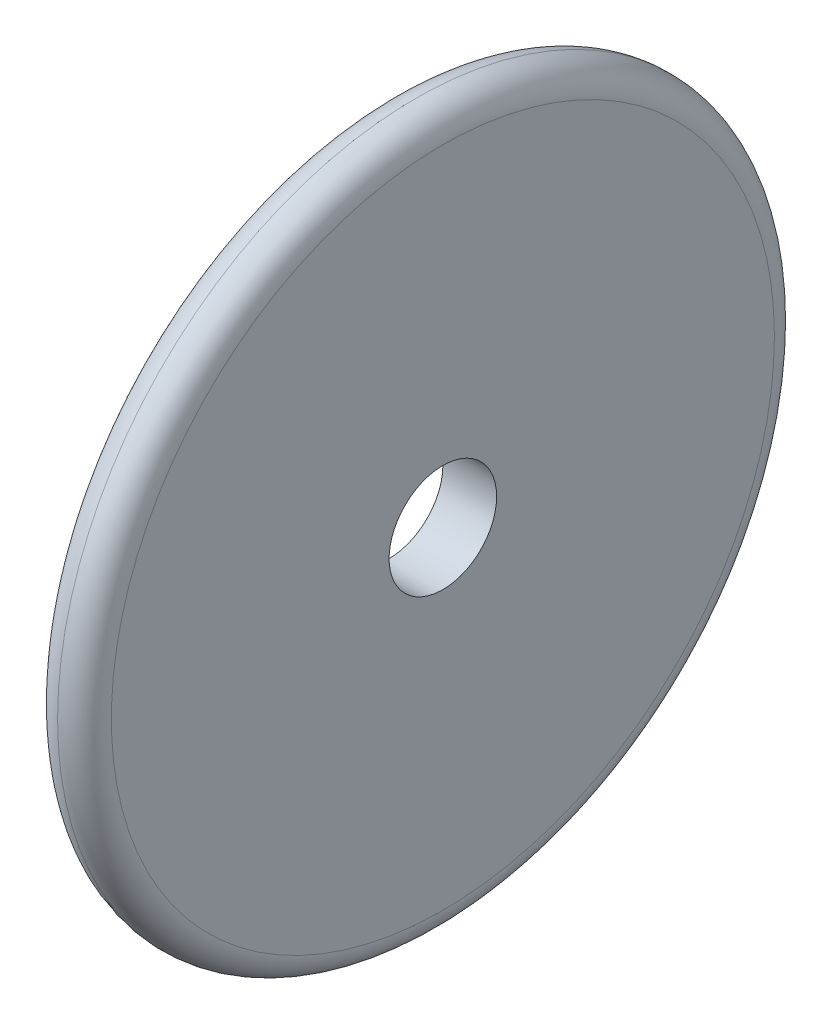
ISO-10303-21;
HEADER;
FILE_DESCRIPTION(('STEP AP214'),'2;1');
FILE_NAME('part.step','',(''),(''),'','','');
FILE_SCHEMA(('AUTOMOTIVE_DESIGN { 1 0 10303 214 1 1 1 1 }'));
ENDSEC;
DATA;
#1=APPLICATION_CONTEXT('core data for automotive mechanical design processes');
#2=APPLICATION_PROTOCOL_DEFINITION('international standard','automotive_design',2000,#1);
#3=PRODUCT_CONTEXT('',#1,'mechanical');
#4=PRODUCT('Part','Part','',(#3));
#5=PRODUCT_RELATED_PRODUCT_CATEGORY('part','',(#4));
#6=PRODUCT_DEFINITION_FORMATION('','',#4);
#7=PRODUCT_DEFINITION_CONTEXT('part definition',#1,'design');
#8=PRODUCT_DEFINITION('design','',#6,#7);
#9=PRODUCT_DEFINITION_SHAPE('','',#8);
#10=(LENGTH_UNIT() NAMED_UNIT(*) SI_UNIT(.MILLI.,.METRE.));
#11=(NAMED_UNIT(*) PLANE_ANGLE_UNIT() SI_UNIT($,.RADIAN.));
#12=(NAMED_UNIT(*) SI_UNIT($,.STERADIAN.) SOLID_ANGLE_UNIT());
#13=UNCERTAINTY_MEASURE_WITH_UNIT(LENGTH_MEASURE(1.E-05),#10,'distance_accuracy_value','');
#14=(GEOMETRIC_REPRESENTATION_CONTEXT(3) GLOBAL_UNCERTAINTY_ASSIGNED_CONTEXT((#13)) GLOBAL_UNIT_ASSIGNED_CONTEXT((#10,
#11,#12)) REPRESENTATION_CONTEXT('',''));
#15=CARTESIAN_POINT('',(0.,0.,0.));
#16=DIRECTION('',(0.,0.,1.));
#17=DIRECTION('',(1.,0.,0.));
#18=AXIS2_PLACEMENT_3D('',#15,#16,#17);
#19=CARTESIAN_POINT('',(1.5,0.,0.));
#20=DIRECTION('',(1.,0.,0.));
#21=DIRECTION('',(0.,0.,-1.));
#22=AXIS2_PLACEMENT_3D('',#19,#20,#21);
#23=PLANE('',#22);
#24=CARTESIAN_POINT('',(1.5,0.,0.));
#25=DIRECTION('',(1.,0.,0.));
#26=DIRECTION('',(0.,0.,-1.));
#27=AXIS2_PLACEMENT_3D('',#24,#25,#26);
#28=CIRCLE('',#27,9.25);
#29=CARTESIAN_POINT('',(1.5,0.,-9.25));
#30=VERTEX_POINT('',#29);
#31=EDGE_CURVE('E52',#30,#30,#28,.T.);
#32=ORIENTED_EDGE('',*,*,#31,.T.);
#33=EDGE_LOOP('',(#32));
#34=FACE_BOUND('',#33,.T.);
#35=CARTESIAN_POINT('',(1.5,0.,0.));
#36=DIRECTION('',(1.,0.,0.));
#37=DIRECTION('',(0.,0.,-1.));
#38=AXIS2_PLACEMENT_3D('',#35,#36,#37);
#39=CIRCLE('',#38,1.5);
#40=CARTESIAN_POINT('',(1.5,0.,-1.5));
#41=VERTEX_POINT('',#40);
#42=EDGE_CURVE('E57',#41,#41,#39,.T.);
#43=ORIENTED_EDGE('',*,*,#42,.F.);
#44=EDGE_LOOP('',(#43));
#45=FACE_BOUND('',#44,.T.);
#46=ADVANCED_FACE('F43',(#34,#45),#23,.T.);
#47=CARTESIAN_POINT('',(0.,0.,0.));
#48=DIRECTION('',(1.,0.,0.));
#49=DIRECTION('',(0.,0.,-1.));
#50=AXIS2_PLACEMENT_3D('',#47,#48,#49);
#51=PLANE('',#50);
#52=CARTESIAN_POINT('',(0.,0.,0.));
#53=DIRECTION('',(1.,0.,0.));
#54=DIRECTION('',(0.,0.,-1.));
#55=AXIS2_PLACEMENT_3D('',#52,#53,#54);
#56=CIRCLE('',#55,9.25);
#57=CARTESIAN_POINT('',(0.,0.,-9.25));
#58=VERTEX_POINT('',#57);
#59=EDGE_CURVE('E10',#58,#58,#56,.F.);
#60=ORIENTED_EDGE('',*,*,#59,.T.);
#61=EDGE_LOOP('',(#60));
#62=FACE_BOUND('',#61,.T.);
#63=CARTESIAN_POINT('',(0.,0.,0.));
#64=DIRECTION('',(1.,0.,0.));
#65=DIRECTION('',(0.,0.,-1.));
#66=AXIS2_PLACEMENT_3D('',#63,#64,#65);
#67=CIRCLE('',#66,1.5);
#68=CARTESIAN_POINT('',(0.,0.,-1.5));
#69=VERTEX_POINT('',#68);
#70=EDGE_CURVE('E60',#69,#69,#67,.T.);
#71=ORIENTED_EDGE('',*,*,#70,.T.);
#72=EDGE_LOOP('',(#71));
#73=FACE_BOUND('',#72,.T.);
#74=ADVANCED_FACE('F72',(#62,#73),#51,.F.);
#75=CARTESIAN_POINT('',(1.5,0.,0.));
#76=DIRECTION('',(-1.,0.,0.));
#77=DIRECTION('',(0.,0.,1.));
#78=AXIS2_PLACEMENT_3D('',#75,#76,#77);
#79=CYLINDRICAL_SURFACE('',#78,1.5);
#80=ORIENTED_EDGE('',*,*,#42,.T.);
#81=EDGE_LOOP('',(#80));
#82=FACE_BOUND('',#81,.T.);
#83=ORIENTED_EDGE('',*,*,#70,.F.);
#84=EDGE_LOOP('',(#83));
#85=FACE_BOUND('',#84,.T.);
#86=ADVANCED_FACE('F68',(#82,#85),#79,.F.);
#87=CARTESIAN_POINT('',(0.75,0.,0.));
#88=DIRECTION('',(1.,0.,0.));
#89=DIRECTION('',(0.,0.,-1.));
#90=AXIS2_PLACEMENT_3D('',#87,#88,#89);
#91=TOROIDAL_SURFACE('',#90,9.25,0.75);
#92=ORIENTED_EDGE('',*,*,#59,.F.);
#93=EDGE_LOOP('',(#92));
#94=FACE_BOUND('',#93,.T.);
#95=CARTESIAN_POINT('',(0.75,0.,0.));
#96=DIRECTION('',(1.,0.,0.));
#97=DIRECTION('',(0.,0.,-1.));
#98=AXIS2_PLACEMENT_3D('',#95,#96,#97);
#99=CIRCLE('',#98,10.);
#100=CARTESIAN_POINT('',(0.75,0.,-10.));
#101=VERTEX_POINT('',#100);
#102=EDGE_CURVE('E47',#101,#101,#99,.T.);
#103=ORIENTED_EDGE('',*,*,#102,.F.);
#104=EDGE_LOOP('',(#103));
#105=FACE_BOUND('',#104,.T.);
#106=ADVANCED_FACE('F45',(#94,#105),#91,.T.);
#107=CARTESIAN_POINT('',(0.75,0.,0.));
#108=DIRECTION('',(1.,0.,0.));
#109=DIRECTION('',(0.,0.,-1.));
#110=AXIS2_PLACEMENT_3D('',#107,#108,#109);
#111=TOROIDAL_SURFACE('',#110,9.25,0.75);
#112=ORIENTED_EDGE('',*,*,#102,.T.);
#113=EDGE_LOOP('',(#112));
#114=FACE_BOUND('',#113,.T.);
#115=ORIENTED_EDGE('',*,*,#31,.F.);
#116=EDGE_LOOP('',(#115));
#117=FACE_BOUND('',#116,.T.);
#118=ADVANCED_FACE('F81',(#114,#117),#111,.T.);
#119=CLOSED_SHELL('',(#46,#74,#86,#106,#118));
#120=MANIFOLD_SOLID_BREP('B2',#119);
#121=ADVANCED_BREP_SHAPE_REPRESENTATION('',(#18,#120),#14);
#122=SHAPE_DEFINITION_REPRESENTATION(#9,#121);
ENDSEC;
END-ISO-10303-21;
